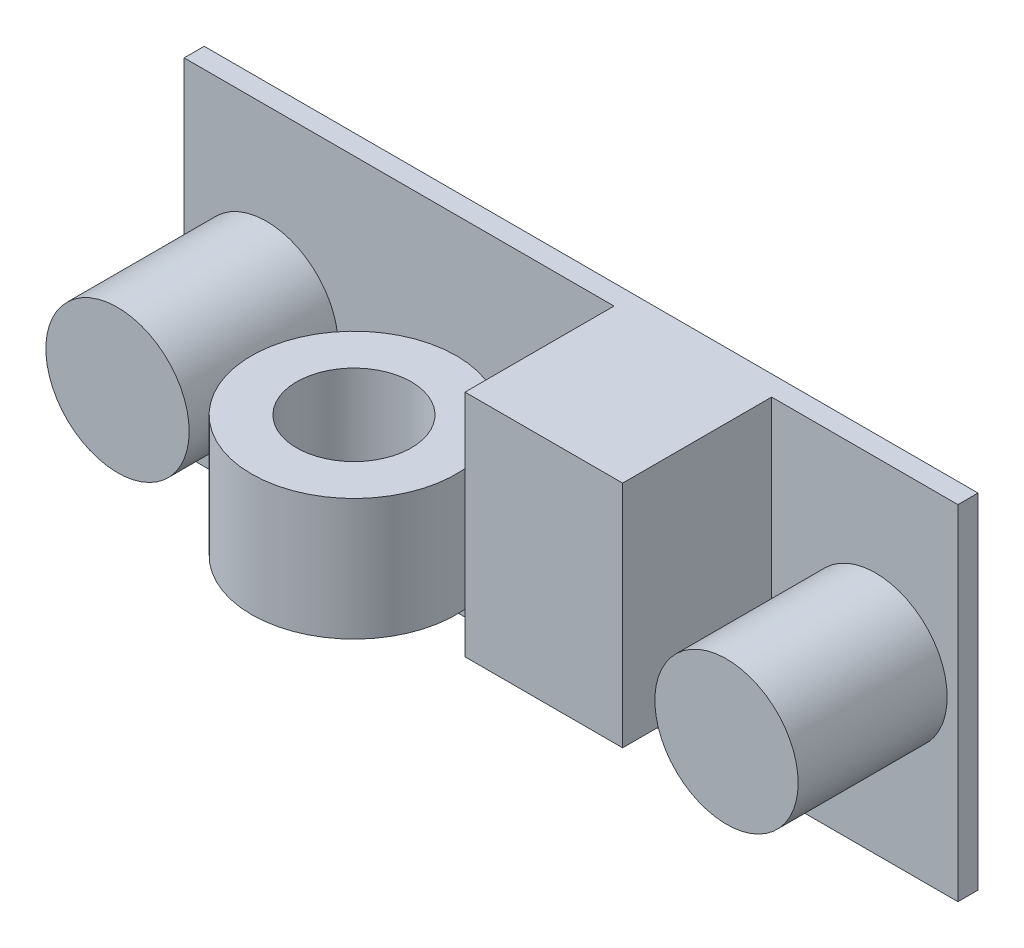
ISO-10303-21;
HEADER;
FILE_DESCRIPTION(('STEP AP214'),'2;1');
FILE_NAME('part.step','',(''),(''),'','','');
FILE_SCHEMA(('AUTOMOTIVE_DESIGN { 1 0 10303 214 1 1 1 1 }'));
ENDSEC;
DATA;
#1=APPLICATION_CONTEXT('core data for automotive mechanical design processes');
#2=APPLICATION_PROTOCOL_DEFINITION('international standard','automotive_design',2000,#1);
#3=PRODUCT_CONTEXT('',#1,'mechanical');
#4=PRODUCT('Part','Part','',(#3));
#5=PRODUCT_RELATED_PRODUCT_CATEGORY('part','',(#4));
#6=PRODUCT_DEFINITION_FORMATION('','',#4);
#7=PRODUCT_DEFINITION_CONTEXT('part definition',#1,'design');
#8=PRODUCT_DEFINITION('design','',#6,#7);
#9=PRODUCT_DEFINITION_SHAPE('','',#8);
#10=(LENGTH_UNIT() NAMED_UNIT(*) SI_UNIT(.MILLI.,.METRE.));
#11=(NAMED_UNIT(*) PLANE_ANGLE_UNIT() SI_UNIT($,.RADIAN.));
#12=(NAMED_UNIT(*) SI_UNIT($,.STERADIAN.) SOLID_ANGLE_UNIT());
#13=UNCERTAINTY_MEASURE_WITH_UNIT(LENGTH_MEASURE(1.E-05),#10,'distance_accuracy_value','');
#14=(GEOMETRIC_REPRESENTATION_CONTEXT(3) GLOBAL_UNCERTAINTY_ASSIGNED_CONTEXT((#13)) GLOBAL_UNIT_ASSIGNED_CONTEXT((#10,
#11,#12)) REPRESENTATION_CONTEXT('',''));
#15=CARTESIAN_POINT('',(0.,0.,0.));
#16=DIRECTION('',(0.,0.,1.));
#17=DIRECTION('',(1.,0.,0.));
#18=AXIS2_PLACEMENT_3D('',#15,#16,#17);
#19=CARTESIAN_POINT('',(-7.99999999999999,32.2232539419353,8.55));
#20=DIRECTION('',(0.,-1.,0.));
#21=DIRECTION('',(0.,0.,-1.));
#22=AXIS2_PLACEMENT_3D('',#19,#20,#21);
#23=CYLINDRICAL_SURFACE('',#22,7.15);
#24=CARTESIAN_POINT('',(-7.99999999999999,3.5,8.55));
#25=DIRECTION('',(0.,-1.,0.));
#26=DIRECTION('',(0.,0.,-1.));
#27=AXIS2_PLACEMENT_3D('',#24,#25,#26);
#28=CIRCLE('',#27,7.15);
#29=CARTESIAN_POINT('',(-7.99999999999999,3.5,1.4));
#30=VERTEX_POINT('',#29);
#31=EDGE_CURVE('E49',#30,#30,#28,.T.);
#32=ORIENTED_EDGE('',*,*,#31,.T.);
#33=EDGE_LOOP('',(#32));
#34=FACE_BOUND('',#33,.T.);
#35=CARTESIAN_POINT('',(-7.99999999999999,-5.,8.55));
#36=DIRECTION('',(0.,1.,0.));
#37=DIRECTION('',(0.,0.,1.));
#38=AXIS2_PLACEMENT_3D('',#35,#36,#37);
#39=CIRCLE('',#38,7.15);
#40=CARTESIAN_POINT('',(-7.99999999999999,-5.,15.7));
#41=VERTEX_POINT('',#40);
#42=EDGE_CURVE('E57',#41,#41,#39,.F.);
#43=ORIENTED_EDGE('',*,*,#42,.F.);
#44=EDGE_LOOP('',(#43));
#45=FACE_BOUND('',#44,.T.);
#46=ADVANCED_FACE('F42',(#34,#45),#23,.T.);
#47=CARTESIAN_POINT('',(-7.99999999999999,32.2232539419353,8.55));
#48=DIRECTION('',(0.,-1.,0.));
#49=DIRECTION('',(0.,0.,-1.));
#50=AXIS2_PLACEMENT_3D('',#47,#48,#49);
#51=CYLINDRICAL_SURFACE('',#50,4.);
#52=CARTESIAN_POINT('',(-7.99999999999999,3.5,8.55));
#53=DIRECTION('',(0.,-1.,0.));
#54=DIRECTION('',(0.,0.,-1.));
#55=AXIS2_PLACEMENT_3D('',#52,#53,#54);
#56=CIRCLE('',#55,4.);
#57=CARTESIAN_POINT('',(-7.99999999999999,3.5,4.55));
#58=VERTEX_POINT('',#57);
#59=EDGE_CURVE('E11',#58,#58,#56,.T.);
#60=ORIENTED_EDGE('',*,*,#59,.F.);
#61=EDGE_LOOP('',(#60));
#62=FACE_BOUND('',#61,.T.);
#63=CARTESIAN_POINT('',(-7.99999999999999,-5.,8.55));
#64=DIRECTION('',(0.,1.,0.));
#65=DIRECTION('',(0.,0.,1.));
#66=AXIS2_PLACEMENT_3D('',#63,#64,#65);
#67=CIRCLE('',#66,4.);
#68=CARTESIAN_POINT('',(-7.99999999999999,-5.,12.55));
#69=VERTEX_POINT('',#68);
#70=EDGE_CURVE('E53',#69,#69,#67,.F.);
#71=ORIENTED_EDGE('',*,*,#70,.T.);
#72=EDGE_LOOP('',(#71));
#73=FACE_BOUND('',#72,.T.);
#74=ADVANCED_FACE('F67',(#62,#73),#51,.F.);
#75=CARTESIAN_POINT('',(-27.,3.5,1.4));
#76=DIRECTION('',(0.,-1.,0.));
#77=DIRECTION('',(0.,0.,-1.));
#78=AXIS2_PLACEMENT_3D('',#75,#76,#77);
#79=PLANE('',#78);
#80=ORIENTED_EDGE('',*,*,#59,.T.);
#81=EDGE_LOOP('',(#80));
#82=FACE_BOUND('',#81,.T.);
#83=ORIENTED_EDGE('',*,*,#31,.F.);
#84=EDGE_LOOP('',(#83));
#85=FACE_BOUND('',#84,.T.);
#86=ADVANCED_FACE('F44',(#82,#85),#79,.F.);
#87=CARTESIAN_POINT('',(-27.,-5.,1.4));
#88=DIRECTION('',(0.,1.,0.));
#89=DIRECTION('',(0.,0.,1.));
#90=AXIS2_PLACEMENT_3D('',#87,#88,#89);
#91=PLANE('',#90);
#92=ORIENTED_EDGE('',*,*,#42,.T.);
#93=EDGE_LOOP('',(#92));
#94=FACE_BOUND('',#93,.T.);
#95=ORIENTED_EDGE('',*,*,#70,.F.);
#96=EDGE_LOOP('',(#95));
#97=FACE_BOUND('',#96,.T.);
#98=ADVANCED_FACE('F63',(#94,#97),#91,.F.);
#99=CLOSED_SHELL('',(#46,#74,#86,#98));
#100=MANIFOLD_SOLID_BREP('B2',#99);
#101=CARTESIAN_POINT('',(0.,0.,1.4));
#102=DIRECTION('',(0.,0.,1.));
#103=DIRECTION('',(1.,0.,0.));
#104=AXIS2_PLACEMENT_3D('',#101,#102,#103);
#105=PLANE('',#104);
#106=CARTESIAN_POINT('',(-21.25,0.,1.4));
#107=DIRECTION('',(0.,0.,1.));
#108=DIRECTION('',(1.,0.,0.));
#109=AXIS2_PLACEMENT_3D('',#106,#107,#108);
#110=CIRCLE('',#109,5.);
#111=CARTESIAN_POINT('',(-16.25,0.,1.4));
#112=VERTEX_POINT('',#111);
#113=EDGE_CURVE('E202',#112,#112,#110,.T.);
#114=ORIENTED_EDGE('',*,*,#113,.F.);
#115=EDGE_LOOP('',(#114));
#116=FACE_BOUND('',#115,.T.);
#117=CARTESIAN_POINT('',(21.25,0.,1.4));
#118=DIRECTION('',(0.,0.,1.));
#119=DIRECTION('',(1.,0.,0.));
#120=AXIS2_PLACEMENT_3D('',#117,#118,#119);
#121=CIRCLE('',#120,5.);
#122=CARTESIAN_POINT('',(26.25,0.,1.4));
#123=VERTEX_POINT('',#122);
#124=EDGE_CURVE('E211',#123,#123,#121,.T.);
#125=ORIENTED_EDGE('',*,*,#124,.F.);
#126=EDGE_LOOP('',(#125));
#127=FACE_BOUND('',#126,.T.);
#128=DIRECTION('',(-1.,0.,0.));
#129=VECTOR('',#128,1.);
#130=CARTESIAN_POINT('',(-27.,12.,1.4));
#131=LINE('',#130,#129);
#132=CARTESIAN_POINT('',(27.,12.,1.4));
#133=VERTEX_POINT('',#132);
#134=CARTESIAN_POINT('',(14.,12.,1.4));
#135=VERTEX_POINT('',#134);
#136=EDGE_CURVE('E157',#133,#135,#131,.T.);
#137=ORIENTED_EDGE('',*,*,#136,.T.);
#138=DIRECTION('',(0.,1.,0.));
#139=VECTOR('',#138,1.);
#140=CARTESIAN_POINT('',(14.,12.,1.4));
#141=LINE('',#140,#139);
#142=CARTESIAN_POINT('',(14.,-4.,1.4));
#143=VERTEX_POINT('',#142);
#144=EDGE_CURVE('E201',#143,#135,#141,.T.);
#145=ORIENTED_EDGE('',*,*,#144,.F.);
#146=DIRECTION('',(1.,0.,0.));
#147=VECTOR('',#146,1.);
#148=CARTESIAN_POINT('',(3.00000000000001,-4.,1.4));
#149=LINE('',#148,#147);
#150=CARTESIAN_POINT('',(3.00000000000001,-4.,1.4));
#151=VERTEX_POINT('',#150);
#152=EDGE_CURVE('E197',#151,#143,#149,.T.);
#153=ORIENTED_EDGE('',*,*,#152,.F.);
#154=DIRECTION('',(0.,-1.,0.));
#155=VECTOR('',#154,1.);
#156=CARTESIAN_POINT('',(3.,12.,1.4));
#157=LINE('',#156,#155);
#158=CARTESIAN_POINT('',(3.,12.,1.4));
#159=VERTEX_POINT('',#158);
#160=EDGE_CURVE('E378',#159,#151,#157,.T.);
#161=ORIENTED_EDGE('',*,*,#160,.F.);
#162=CARTESIAN_POINT('',(-27.,12.,1.4));
#163=VERTEX_POINT('',#162);
#164=EDGE_CURVE('E221',#159,#163,#131,.T.);
#165=ORIENTED_EDGE('',*,*,#164,.T.);
#166=DIRECTION('',(0.,-1.,0.));
#167=VECTOR('',#166,1.);
#168=CARTESIAN_POINT('',(-27.,12.,1.4));
#169=LINE('',#168,#167);
#170=CARTESIAN_POINT('',(-27.,-12.,1.4));
#171=VERTEX_POINT('',#170);
#172=EDGE_CURVE('E223',#163,#171,#169,.T.);
#173=ORIENTED_EDGE('',*,*,#172,.T.);
#174=DIRECTION('',(1.,0.,0.));
#175=VECTOR('',#174,1.);
#176=CARTESIAN_POINT('',(-27.,-12.,1.4));
#177=LINE('',#176,#175);
#178=CARTESIAN_POINT('',(27.,-12.,1.4));
#179=VERTEX_POINT('',#178);
#180=EDGE_CURVE('E129',#171,#179,#177,.T.);
#181=ORIENTED_EDGE('',*,*,#180,.T.);
#182=DIRECTION('',(0.,1.,0.));
#183=VECTOR('',#182,1.);
#184=CARTESIAN_POINT('',(27.,12.,1.4));
#185=LINE('',#184,#183);
#186=EDGE_CURVE('E219',#179,#133,#185,.T.);
#187=ORIENTED_EDGE('',*,*,#186,.T.);
#188=EDGE_LOOP('',(#137,#145,#153,#161,#165,#173,#181,#187));
#189=FACE_BOUND('',#188,.T.);
#190=ADVANCED_FACE('F105',(#116,#127,#189),#105,.T.);
#191=CARTESIAN_POINT('',(27.,12.,1.4));
#192=DIRECTION('',(-1.,0.,0.));
#193=DIRECTION('',(0.,0.,1.));
#194=AXIS2_PLACEMENT_3D('',#191,#192,#193);
#195=PLANE('',#194);
#196=DIRECTION('',(0.,1.,0.));
#197=VECTOR('',#196,1.);
#198=CARTESIAN_POINT('',(27.,12.,0.));
#199=LINE('',#198,#197);
#200=CARTESIAN_POINT('',(27.,-12.,0.));
#201=VERTEX_POINT('',#200);
#202=CARTESIAN_POINT('',(27.,12.,0.));
#203=VERTEX_POINT('',#202);
#204=EDGE_CURVE('E216',#201,#203,#199,.T.);
#205=ORIENTED_EDGE('',*,*,#204,.T.);
#206=DIRECTION('',(0.,0.,-1.));
#207=VECTOR('',#206,1.);
#208=CARTESIAN_POINT('',(27.,12.,1.4));
#209=LINE('',#208,#207);
#210=EDGE_CURVE('E40',#133,#203,#209,.T.);
#211=ORIENTED_EDGE('',*,*,#210,.F.);
#212=ORIENTED_EDGE('',*,*,#186,.F.);
#213=DIRECTION('',(0.,0.,-1.));
#214=VECTOR('',#213,1.);
#215=CARTESIAN_POINT('',(27.,-12.,1.4));
#216=LINE('',#215,#214);
#217=EDGE_CURVE('E226',#179,#201,#216,.T.);
#218=ORIENTED_EDGE('',*,*,#217,.T.);
#219=EDGE_LOOP('',(#205,#211,#212,#218));
#220=FACE_BOUND('',#219,.T.);
#221=ADVANCED_FACE('F107',(#220),#195,.F.);
#222=CARTESIAN_POINT('',(-27.,12.,1.4));
#223=DIRECTION('',(0.,-1.,0.));
#224=DIRECTION('',(0.,0.,-1.));
#225=AXIS2_PLACEMENT_3D('',#222,#223,#224);
#226=PLANE('',#225);
#227=DIRECTION('',(-1.,0.,0.));
#228=VECTOR('',#227,1.);
#229=CARTESIAN_POINT('',(-27.,12.,0.));
#230=LINE('',#229,#228);
#231=CARTESIAN_POINT('',(-27.,12.,0.));
#232=VERTEX_POINT('',#231);
#233=EDGE_CURVE('E229',#203,#232,#230,.T.);
#234=ORIENTED_EDGE('',*,*,#233,.T.);
#235=DIRECTION('',(0.,0.,-1.));
#236=VECTOR('',#235,1.);
#237=CARTESIAN_POINT('',(-27.,12.,1.4));
#238=LINE('',#237,#236);
#239=EDGE_CURVE('E113',#163,#232,#238,.T.);
#240=ORIENTED_EDGE('',*,*,#239,.F.);
#241=ORIENTED_EDGE('',*,*,#164,.F.);
#242=DIRECTION('',(0.,0.,-1.));
#243=VECTOR('',#242,1.);
#244=CARTESIAN_POINT('',(3.,12.,11.8));
#245=LINE('',#244,#243);
#246=CARTESIAN_POINT('',(3.,12.,11.8));
#247=VERTEX_POINT('',#246);
#248=EDGE_CURVE('E185',#247,#159,#245,.T.);
#249=ORIENTED_EDGE('',*,*,#248,.F.);
#250=DIRECTION('',(-1.,0.,0.));
#251=VECTOR('',#250,1.);
#252=CARTESIAN_POINT('',(3.,12.,11.8));
#253=LINE('',#252,#251);
#254=CARTESIAN_POINT('',(14.,12.,11.8));
#255=VERTEX_POINT('',#254);
#256=EDGE_CURVE('E178',#255,#247,#253,.T.);
#257=ORIENTED_EDGE('',*,*,#256,.F.);
#258=DIRECTION('',(0.,0.,-1.));
#259=VECTOR('',#258,1.);
#260=CARTESIAN_POINT('',(14.,12.,11.8));
#261=LINE('',#260,#259);
#262=EDGE_CURVE('E182',#255,#135,#261,.T.);
#263=ORIENTED_EDGE('',*,*,#262,.T.);
#264=ORIENTED_EDGE('',*,*,#136,.F.);
#265=ORIENTED_EDGE('',*,*,#210,.T.);
#266=EDGE_LOOP('',(#234,#240,#241,#249,#257,#263,#264,#265));
#267=FACE_BOUND('',#266,.T.);
#268=ADVANCED_FACE('F180',(#267),#226,.F.);
#269=CARTESIAN_POINT('',(-27.,12.,1.4));
#270=DIRECTION('',(1.,0.,0.));
#271=DIRECTION('',(0.,1.,0.));
#272=AXIS2_PLACEMENT_3D('',#269,#270,#271);
#273=PLANE('',#272);
#274=DIRECTION('',(0.,-1.,0.));
#275=VECTOR('',#274,1.);
#276=CARTESIAN_POINT('',(-27.,12.,0.));
#277=LINE('',#276,#275);
#278=CARTESIAN_POINT('',(-27.,-12.,0.));
#279=VERTEX_POINT('',#278);
#280=EDGE_CURVE('E231',#232,#279,#277,.T.);
#281=ORIENTED_EDGE('',*,*,#280,.T.);
#282=DIRECTION('',(0.,0.,-1.));
#283=VECTOR('',#282,1.);
#284=CARTESIAN_POINT('',(-27.,-12.,1.4));
#285=LINE('',#284,#283);
#286=EDGE_CURVE('E235',#171,#279,#285,.T.);
#287=ORIENTED_EDGE('',*,*,#286,.F.);
#288=ORIENTED_EDGE('',*,*,#172,.F.);
#289=ORIENTED_EDGE('',*,*,#239,.T.);
#290=EDGE_LOOP('',(#281,#287,#288,#289));
#291=FACE_BOUND('',#290,.T.);
#292=ADVANCED_FACE('F241',(#291),#273,.F.);
#293=CARTESIAN_POINT('',(-27.,-12.,1.4));
#294=DIRECTION('',(0.,1.,0.));
#295=DIRECTION('',(0.,0.,1.));
#296=AXIS2_PLACEMENT_3D('',#293,#294,#295);
#297=PLANE('',#296);
#298=DIRECTION('',(1.,0.,0.));
#299=VECTOR('',#298,1.);
#300=CARTESIAN_POINT('',(-27.,-12.,0.));
#301=LINE('',#300,#299);
#302=EDGE_CURVE('E150',#279,#201,#301,.T.);
#303=ORIENTED_EDGE('',*,*,#302,.T.);
#304=ORIENTED_EDGE('',*,*,#217,.F.);
#305=ORIENTED_EDGE('',*,*,#180,.F.);
#306=ORIENTED_EDGE('',*,*,#286,.T.);
#307=EDGE_LOOP('',(#303,#304,#305,#306));
#308=FACE_BOUND('',#307,.T.);
#309=ADVANCED_FACE('F249',(#308),#297,.F.);
#310=CARTESIAN_POINT('',(0.,0.,0.));
#311=DIRECTION('',(0.,0.,1.));
#312=DIRECTION('',(1.,0.,0.));
#313=AXIS2_PLACEMENT_3D('',#310,#311,#312);
#314=PLANE('',#313);
#315=ORIENTED_EDGE('',*,*,#204,.F.);
#316=ORIENTED_EDGE('',*,*,#302,.F.);
#317=ORIENTED_EDGE('',*,*,#280,.F.);
#318=ORIENTED_EDGE('',*,*,#233,.F.);
#319=EDGE_LOOP('',(#315,#316,#317,#318));
#320=FACE_BOUND('',#319,.T.);
#321=ADVANCED_FACE('F245',(#320),#314,.F.);
#322=CARTESIAN_POINT('',(21.25,0.,11.8));
#323=DIRECTION('',(0.,0.,-1.));
#324=DIRECTION('',(-1.,0.,0.));
#325=AXIS2_PLACEMENT_3D('',#322,#323,#324);
#326=CYLINDRICAL_SURFACE('',#325,5.);
#327=CARTESIAN_POINT('',(21.25,0.,11.8));
#328=DIRECTION('',(0.,0.,1.));
#329=DIRECTION('',(1.,0.,0.));
#330=AXIS2_PLACEMENT_3D('',#327,#328,#329);
#331=CIRCLE('',#330,5.);
#332=CARTESIAN_POINT('',(26.25,0.,11.8));
#333=VERTEX_POINT('',#332);
#334=EDGE_CURVE('E213',#333,#333,#331,.T.);
#335=ORIENTED_EDGE('',*,*,#334,.F.);
#336=EDGE_LOOP('',(#335));
#337=FACE_BOUND('',#336,.T.);
#338=ORIENTED_EDGE('',*,*,#124,.T.);
#339=EDGE_LOOP('',(#338));
#340=FACE_BOUND('',#339,.T.);
#341=ADVANCED_FACE('F256',(#337,#340),#326,.T.);
#342=CARTESIAN_POINT('',(21.25,0.,11.8));
#343=DIRECTION('',(0.,0.,1.));
#344=DIRECTION('',(1.,0.,0.));
#345=AXIS2_PLACEMENT_3D('',#342,#343,#344);
#346=PLANE('',#345);
#347=ORIENTED_EDGE('',*,*,#334,.T.);
#348=EDGE_LOOP('',(#347));
#349=FACE_BOUND('',#348,.T.);
#350=ADVANCED_FACE('F270',(#349),#346,.T.);
#351=CARTESIAN_POINT('',(-21.25,0.,11.8));
#352=DIRECTION('',(0.,0.,-1.));
#353=DIRECTION('',(-1.,0.,0.));
#354=AXIS2_PLACEMENT_3D('',#351,#352,#353);
#355=CYLINDRICAL_SURFACE('',#354,5.);
#356=CARTESIAN_POINT('',(-21.25,0.,11.8));
#357=DIRECTION('',(0.,0.,1.));
#358=DIRECTION('',(1.,0.,0.));
#359=AXIS2_PLACEMENT_3D('',#356,#357,#358);
#360=CIRCLE('',#359,5.);
#361=CARTESIAN_POINT('',(-16.25,0.,11.8));
#362=VERTEX_POINT('',#361);
#363=EDGE_CURVE('E205',#362,#362,#360,.T.);
#364=ORIENTED_EDGE('',*,*,#363,.F.);
#365=EDGE_LOOP('',(#364));
#366=FACE_BOUND('',#365,.T.);
#367=ORIENTED_EDGE('',*,*,#113,.T.);
#368=EDGE_LOOP('',(#367));
#369=FACE_BOUND('',#368,.T.);
#370=ADVANCED_FACE('F274',(#366,#369),#355,.T.);
#371=CARTESIAN_POINT('',(-21.25,0.,11.8));
#372=DIRECTION('',(0.,0.,1.));
#373=DIRECTION('',(1.,0.,0.));
#374=AXIS2_PLACEMENT_3D('',#371,#372,#373);
#375=PLANE('',#374);
#376=ORIENTED_EDGE('',*,*,#363,.T.);
#377=EDGE_LOOP('',(#376));
#378=FACE_BOUND('',#377,.T.);
#379=ADVANCED_FACE('F278',(#378),#375,.T.);
#380=CARTESIAN_POINT('',(14.,12.,11.8));
#381=DIRECTION('',(-1.,0.,0.));
#382=DIRECTION('',(0.,0.,1.));
#383=AXIS2_PLACEMENT_3D('',#380,#381,#382);
#384=PLANE('',#383);
#385=ORIENTED_EDGE('',*,*,#144,.T.);
#386=ORIENTED_EDGE('',*,*,#262,.F.);
#387=DIRECTION('',(0.,1.,0.));
#388=VECTOR('',#387,1.);
#389=CARTESIAN_POINT('',(14.,12.,11.8));
#390=LINE('',#389,#388);
#391=CARTESIAN_POINT('',(14.,-4.,11.8));
#392=VERTEX_POINT('',#391);
#393=EDGE_CURVE('E189',#392,#255,#390,.T.);
#394=ORIENTED_EDGE('',*,*,#393,.F.);
#395=DIRECTION('',(0.,0.,-1.));
#396=VECTOR('',#395,1.);
#397=CARTESIAN_POINT('',(14.,-4.,11.8));
#398=LINE('',#397,#396);
#399=EDGE_CURVE('E376',#392,#143,#398,.T.);
#400=ORIENTED_EDGE('',*,*,#399,.T.);
#401=EDGE_LOOP('',(#385,#386,#394,#400));
#402=FACE_BOUND('',#401,.T.);
#403=ADVANCED_FACE('F199',(#402),#384,.F.);
#404=CARTESIAN_POINT('',(3.,12.,11.8));
#405=DIRECTION('',(1.,0.,0.));
#406=DIRECTION('',(0.,1.,0.));
#407=AXIS2_PLACEMENT_3D('',#404,#405,#406);
#408=PLANE('',#407);
#409=ORIENTED_EDGE('',*,*,#160,.T.);
#410=DIRECTION('',(0.,0.,-1.));
#411=VECTOR('',#410,1.);
#412=CARTESIAN_POINT('',(3.00000000000001,-4.,11.8));
#413=LINE('',#412,#411);
#414=CARTESIAN_POINT('',(3.00000000000001,-4.,11.8));
#415=VERTEX_POINT('',#414);
#416=EDGE_CURVE('E120',#415,#151,#413,.T.);
#417=ORIENTED_EDGE('',*,*,#416,.F.);
#418=DIRECTION('',(0.,-1.,0.));
#419=VECTOR('',#418,1.);
#420=CARTESIAN_POINT('',(3.,12.,11.8));
#421=LINE('',#420,#419);
#422=EDGE_CURVE('E188',#247,#415,#421,.T.);
#423=ORIENTED_EDGE('',*,*,#422,.F.);
#424=ORIENTED_EDGE('',*,*,#248,.T.);
#425=EDGE_LOOP('',(#409,#417,#423,#424));
#426=FACE_BOUND('',#425,.T.);
#427=ADVANCED_FACE('F285',(#426),#408,.F.);
#428=CARTESIAN_POINT('',(3.00000000000001,-4.,11.8));
#429=DIRECTION('',(0.,1.,0.));
#430=DIRECTION('',(0.,0.,1.));
#431=AXIS2_PLACEMENT_3D('',#428,#429,#430);
#432=PLANE('',#431);
#433=ORIENTED_EDGE('',*,*,#152,.T.);
#434=ORIENTED_EDGE('',*,*,#399,.F.);
#435=DIRECTION('',(1.,0.,0.));
#436=VECTOR('',#435,1.);
#437=CARTESIAN_POINT('',(3.00000000000001,-4.,11.8));
#438=LINE('',#437,#436);
#439=EDGE_CURVE('E193',#415,#392,#438,.T.);
#440=ORIENTED_EDGE('',*,*,#439,.F.);
#441=ORIENTED_EDGE('',*,*,#416,.T.);
#442=EDGE_LOOP('',(#433,#434,#440,#441));
#443=FACE_BOUND('',#442,.T.);
#444=ADVANCED_FACE('F288',(#443),#432,.F.);
#445=CARTESIAN_POINT('',(0.,0.,11.8));
#446=DIRECTION('',(0.,0.,1.));
#447=DIRECTION('',(1.,0.,0.));
#448=AXIS2_PLACEMENT_3D('',#445,#446,#447);
#449=PLANE('',#448);
#450=ORIENTED_EDGE('',*,*,#393,.T.);
#451=ORIENTED_EDGE('',*,*,#256,.T.);
#452=ORIENTED_EDGE('',*,*,#422,.T.);
#453=ORIENTED_EDGE('',*,*,#439,.T.);
#454=EDGE_LOOP('',(#450,#451,#452,#453));
#455=FACE_BOUND('',#454,.T.);
#456=ADVANCED_FACE('F192',(#455),#449,.T.);
#457=CLOSED_SHELL('',(#190,#221,#268,#292,#309,#321,#341,#350,#370,#379,#403,#427,#444,#456));
#458=MANIFOLD_SOLID_BREP('B6',#457);
#459=ADVANCED_BREP_SHAPE_REPRESENTATION('',(#18,#100,#458),#14);
#460=SHAPE_DEFINITION_REPRESENTATION(#9,#459);
ENDSEC;
END-ISO-10303-21;
